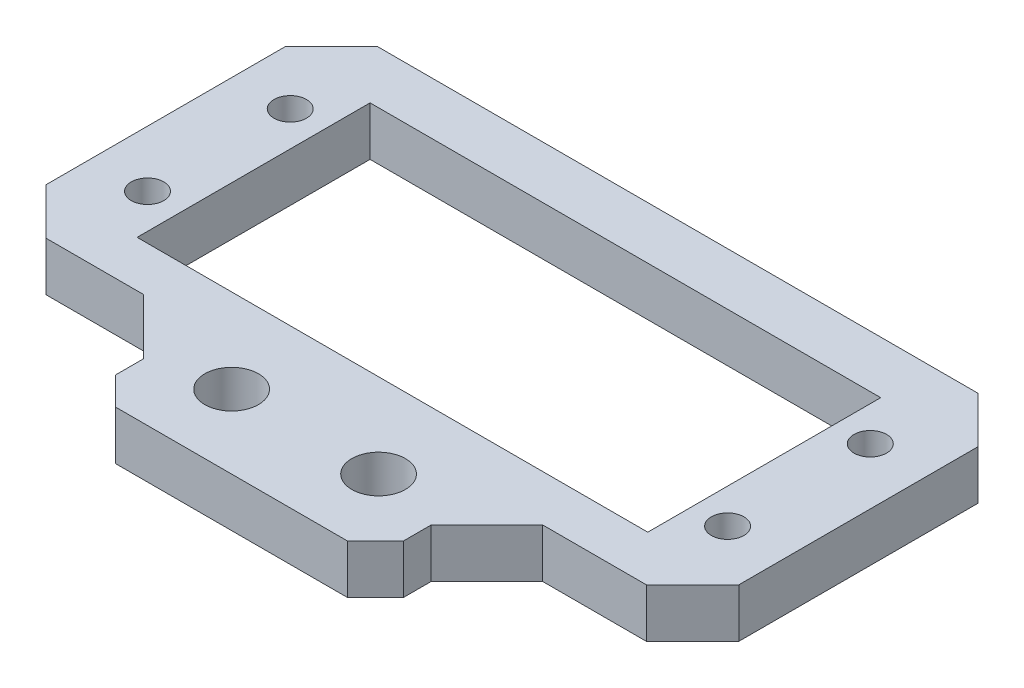
ISO-10303-21;
HEADER;
FILE_DESCRIPTION(('STEP AP214'),'2;1');
FILE_NAME('part.step','',(''),(''),'','','');
FILE_SCHEMA(('AUTOMOTIVE_DESIGN { 1 0 10303 214 1 1 1 1 }'));
ENDSEC;
DATA;
#1=APPLICATION_CONTEXT('core data for automotive mechanical design processes');
#2=APPLICATION_PROTOCOL_DEFINITION('international standard','automotive_design',2000,#1);
#3=PRODUCT_CONTEXT('',#1,'mechanical');
#4=PRODUCT('Part','Part','',(#3));
#5=PRODUCT_RELATED_PRODUCT_CATEGORY('part','',(#4));
#6=PRODUCT_DEFINITION_FORMATION('','',#4);
#7=PRODUCT_DEFINITION_CONTEXT('part definition',#1,'design');
#8=PRODUCT_DEFINITION('design','',#6,#7);
#9=PRODUCT_DEFINITION_SHAPE('','',#8);
#10=(LENGTH_UNIT() NAMED_UNIT(*) SI_UNIT(.MILLI.,.METRE.));
#11=(NAMED_UNIT(*) PLANE_ANGLE_UNIT() SI_UNIT($,.RADIAN.));
#12=(NAMED_UNIT(*) SI_UNIT($,.STERADIAN.) SOLID_ANGLE_UNIT());
#13=UNCERTAINTY_MEASURE_WITH_UNIT(LENGTH_MEASURE(1.E-05),#10,'distance_accuracy_value','');
#14=(GEOMETRIC_REPRESENTATION_CONTEXT(3) GLOBAL_UNCERTAINTY_ASSIGNED_CONTEXT((#13)) GLOBAL_UNIT_ASSIGNED_CONTEXT((#10,
#11,#12)) REPRESENTATION_CONTEXT('',''));
#15=CARTESIAN_POINT('',(0.,0.,0.));
#16=DIRECTION('',(0.,0.,1.));
#17=DIRECTION('',(1.,0.,0.));
#18=AXIS2_PLACEMENT_3D('',#15,#16,#17);
#19=CARTESIAN_POINT('',(0.,6.35,0.));
#20=DIRECTION('',(0.,1.,0.));
#21=DIRECTION('',(0.,0.,1.));
#22=AXIS2_PLACEMENT_3D('',#19,#20,#21);
#23=PLANE('',#22);
#24=CARTESIAN_POINT('',(11.15,6.35,26.022));
#25=DIRECTION('',(0.,1.,0.));
#26=DIRECTION('',(0.,0.,1.));
#27=AXIS2_PLACEMENT_3D('',#24,#25,#26);
#28=CIRCLE('',#27,3.475);
#29=CARTESIAN_POINT('',(11.15,6.35,29.497));
#30=VERTEX_POINT('',#29);
#31=EDGE_CURVE('E649',#30,#30,#28,.T.);
#32=ORIENTED_EDGE('',*,*,#31,.F.);
#33=EDGE_LOOP('',(#32));
#34=FACE_BOUND('',#33,.T.);
#35=CARTESIAN_POINT('',(-16.525,6.35,9.25));
#36=DIRECTION('',(0.,1.,0.));
#37=DIRECTION('',(0.,0.,1.));
#38=AXIS2_PLACEMENT_3D('',#35,#36,#37);
#39=CIRCLE('',#38,2.1082);
#40=CARTESIAN_POINT('',(-16.525,6.35,11.3582));
#41=VERTEX_POINT('',#40);
#42=EDGE_CURVE('E661',#41,#41,#39,.T.);
#43=ORIENTED_EDGE('',*,*,#42,.F.);
#44=EDGE_LOOP('',(#43));
#45=FACE_BOUND('',#44,.T.);
#46=CARTESIAN_POINT('',(58.675,6.35,-9.24999999999999));
#47=DIRECTION('',(0.,1.,0.));
#48=DIRECTION('',(0.,0.,1.));
#49=AXIS2_PLACEMENT_3D('',#46,#47,#48);
#50=CIRCLE('',#49,2.10819999999999);
#51=CARTESIAN_POINT('',(58.675,6.35,-7.1418));
#52=VERTEX_POINT('',#51);
#53=EDGE_CURVE('E198',#52,#52,#50,.T.);
#54=ORIENTED_EDGE('',*,*,#53,.F.);
#55=EDGE_LOOP('',(#54));
#56=FACE_BOUND('',#55,.T.);
#57=DIRECTION('',(-0.707106781186547,0.,0.707106781186548));
#58=VECTOR('',#57,1.);
#59=CARTESIAN_POINT('',(-17.8365349853912,6.35,-21.9));
#60=LINE('',#59,#58);
#61=CARTESIAN_POINT('',(-17.8365349853912,6.35,-21.9));
#62=VERTEX_POINT('',#61);
#63=CARTESIAN_POINT('',(-23.836534985391,6.35,-15.9000000000002));
#64=VERTEX_POINT('',#63);
#65=EDGE_CURVE('E208',#62,#64,#60,.T.);
#66=ORIENTED_EDGE('',*,*,#65,.T.);
#67=DIRECTION('',(0.,0.,1.));
#68=VECTOR('',#67,1.);
#69=CARTESIAN_POINT('',(-23.836534985391,6.35,15.0999999999999));
#70=LINE('',#69,#68);
#71=CARTESIAN_POINT('',(-23.836534985391,6.35,15.0999999999999));
#72=VERTEX_POINT('',#71);
#73=EDGE_CURVE('E211',#64,#72,#70,.T.);
#74=ORIENTED_EDGE('',*,*,#73,.T.);
#75=DIRECTION('',(0.707106781186548,0.,0.707106781186547));
#76=VECTOR('',#75,1.);
#77=CARTESIAN_POINT('',(-23.836534985391,6.35,15.0999999999999));
#78=LINE('',#77,#76);
#79=CARTESIAN_POINT('',(-17.8365349853911,6.35,21.0999999999998));
#80=VERTEX_POINT('',#79);
#81=EDGE_CURVE('E214',#72,#80,#78,.T.);
#82=ORIENTED_EDGE('',*,*,#81,.T.);
#83=DIRECTION('',(1.,0.,0.));
#84=VECTOR('',#83,1.);
#85=CARTESIAN_POINT('',(-5.20135987500388,6.35,21.0999999999998));
#86=LINE('',#85,#84);
#87=CARTESIAN_POINT('',(-5.20135987500388,6.35,21.0999999999998));
#88=VERTEX_POINT('',#87);
#89=EDGE_CURVE('E216',#80,#88,#86,.T.);
#90=ORIENTED_EDGE('',*,*,#89,.T.);
#91=DIRECTION('',(0.707106781186548,0.,0.707106781186547));
#92=VECTOR('',#91,1.);
#93=CARTESIAN_POINT('',(2.02499999999995,6.35,28.3263598750036));
#94=LINE('',#93,#92);
#95=CARTESIAN_POINT('',(2.02499999999995,6.35,28.3263598750036));
#96=VERTEX_POINT('',#95);
#97=EDGE_CURVE('E218',#88,#96,#94,.T.);
#98=ORIENTED_EDGE('',*,*,#97,.T.);
#99=DIRECTION('',(0.,0.,1.));
#100=VECTOR('',#99,1.);
#101=CARTESIAN_POINT('',(2.02499999999995,6.35,31.9395398125056));
#102=LINE('',#101,#100);
#103=CARTESIAN_POINT('',(2.02499999999995,6.35,31.9395398125056));
#104=VERTEX_POINT('',#103);
#105=EDGE_CURVE('E220',#96,#104,#102,.T.);
#106=ORIENTED_EDGE('',*,*,#105,.T.);
#107=DIRECTION('',(0.707106781186548,0.,0.707106781186547));
#108=VECTOR('',#107,1.);
#109=CARTESIAN_POINT('',(2.02499999999995,6.35,31.9395398125056));
#110=LINE('',#109,#108);
#111=CARTESIAN_POINT('',(5.63817993750187,6.35,35.5527197500075));
#112=VERTEX_POINT('',#111);
#113=EDGE_CURVE('E222',#104,#112,#110,.T.);
#114=ORIENTED_EDGE('',*,*,#113,.T.);
#115=DIRECTION('',(1.,0.,0.));
#116=VECTOR('',#115,1.);
#117=CARTESIAN_POINT('',(35.7118200624981,6.35,35.5527197500075));
#118=LINE('',#117,#116);
#119=CARTESIAN_POINT('',(35.7118200624981,6.35,35.5527197500075));
#120=VERTEX_POINT('',#119);
#121=EDGE_CURVE('E224',#112,#120,#118,.T.);
#122=ORIENTED_EDGE('',*,*,#121,.T.);
#123=DIRECTION('',(0.707106781186548,0.,-0.707106781186548));
#124=VECTOR('',#123,1.);
#125=CARTESIAN_POINT('',(39.325,6.35,31.9395398125056));
#126=LINE('',#125,#124);
#127=CARTESIAN_POINT('',(39.325,6.35,31.9395398125056));
#128=VERTEX_POINT('',#127);
#129=EDGE_CURVE('E226',#120,#128,#126,.T.);
#130=ORIENTED_EDGE('',*,*,#129,.T.);
#131=DIRECTION('',(0.,0.,-1.));
#132=VECTOR('',#131,1.);
#133=CARTESIAN_POINT('',(39.325,6.35,31.9395398125056));
#134=LINE('',#133,#132);
#135=CARTESIAN_POINT('',(39.325,6.35,28.3263598750036));
#136=VERTEX_POINT('',#135);
#137=EDGE_CURVE('E228',#128,#136,#134,.T.);
#138=ORIENTED_EDGE('',*,*,#137,.T.);
#139=DIRECTION('',(0.707106781186547,0.,-0.707106781186547));
#140=VECTOR('',#139,1.);
#141=CARTESIAN_POINT('',(39.325,6.35,28.3263598750036));
#142=LINE('',#141,#140);
#143=CARTESIAN_POINT('',(46.5513598750038,6.35,21.0999999999998));
#144=VERTEX_POINT('',#143);
#145=EDGE_CURVE('E230',#136,#144,#142,.T.);
#146=ORIENTED_EDGE('',*,*,#145,.T.);
#147=DIRECTION('',(1.,0.,0.));
#148=VECTOR('',#147,1.);
#149=CARTESIAN_POINT('',(59.986534985391,6.35,21.0999999999998));
#150=LINE('',#149,#148);
#151=CARTESIAN_POINT('',(59.986534985391,6.35,21.0999999999998));
#152=VERTEX_POINT('',#151);
#153=EDGE_CURVE('E232',#144,#152,#150,.T.);
#154=ORIENTED_EDGE('',*,*,#153,.T.);
#155=DIRECTION('',(0.707106781186548,0.,-0.707106781186547));
#156=VECTOR('',#155,1.);
#157=CARTESIAN_POINT('',(65.9865349853909,6.35,15.0999999999999));
#158=LINE('',#157,#156);
#159=CARTESIAN_POINT('',(65.9865349853909,6.35,15.0999999999999));
#160=VERTEX_POINT('',#159);
#161=EDGE_CURVE('E234',#152,#160,#158,.T.);
#162=ORIENTED_EDGE('',*,*,#161,.T.);
#163=DIRECTION('',(0.,0.,-1.));
#164=VECTOR('',#163,1.);
#165=CARTESIAN_POINT('',(65.9865349853909,6.35,15.0999999999999));
#166=LINE('',#165,#164);
#167=CARTESIAN_POINT('',(65.9865349853909,6.35,-15.9000000000002));
#168=VERTEX_POINT('',#167);
#169=EDGE_CURVE('E236',#160,#168,#166,.T.);
#170=ORIENTED_EDGE('',*,*,#169,.T.);
#171=DIRECTION('',(-0.707106781186546,0.,-0.707106781186549));
#172=VECTOR('',#171,1.);
#173=CARTESIAN_POINT('',(59.9865349853912,6.35,-21.9));
#174=LINE('',#173,#172);
#175=CARTESIAN_POINT('',(59.9865349853912,6.35,-21.9));
#176=VERTEX_POINT('',#175);
#177=EDGE_CURVE('E238',#168,#176,#174,.T.);
#178=ORIENTED_EDGE('',*,*,#177,.T.);
#179=DIRECTION('',(-1.,0.,0.));
#180=VECTOR('',#179,1.);
#181=CARTESIAN_POINT('',(59.9865349853912,6.35,-21.9));
#182=LINE('',#181,#180);
#183=EDGE_CURVE('E240',#176,#62,#182,.T.);
#184=ORIENTED_EDGE('',*,*,#183,.T.);
#185=EDGE_LOOP('',(#66,#74,#82,#90,#98,#106,#114,#122,#130,#138,#146,#154,#162,#170,#178,#184));
#186=FACE_BOUND('',#185,.T.);
#187=DIRECTION('',(1.,0.,0.));
#188=VECTOR('',#187,1.);
#189=CARTESIAN_POINT('',(54.175,6.35,15.1));
#190=LINE('',#189,#188);
#191=CARTESIAN_POINT('',(-12.025,6.35,15.1));
#192=VERTEX_POINT('',#191);
#193=CARTESIAN_POINT('',(54.175,6.35,15.1));
#194=VERTEX_POINT('',#193);
#195=EDGE_CURVE('E177',#192,#194,#190,.T.);
#196=ORIENTED_EDGE('',*,*,#195,.F.);
#197=DIRECTION('',(0.,0.,1.));
#198=VECTOR('',#197,1.);
#199=CARTESIAN_POINT('',(-12.025,6.35,15.1));
#200=LINE('',#199,#198);
#201=CARTESIAN_POINT('',(-12.025,6.35,-15.1));
#202=VERTEX_POINT('',#201);
#203=EDGE_CURVE('E169',#202,#192,#200,.T.);
#204=ORIENTED_EDGE('',*,*,#203,.F.);
#205=DIRECTION('',(-1.,0.,0.));
#206=VECTOR('',#205,1.);
#207=CARTESIAN_POINT('',(54.175,6.35,-15.1));
#208=LINE('',#207,#206);
#209=CARTESIAN_POINT('',(54.175,6.35,-15.1));
#210=VERTEX_POINT('',#209);
#211=EDGE_CURVE('E192',#210,#202,#208,.T.);
#212=ORIENTED_EDGE('',*,*,#211,.F.);
#213=DIRECTION('',(0.,0.,-1.));
#214=VECTOR('',#213,1.);
#215=CARTESIAN_POINT('',(54.175,6.35,15.1));
#216=LINE('',#215,#214);
#217=EDGE_CURVE('E190',#194,#210,#216,.T.);
#218=ORIENTED_EDGE('',*,*,#217,.F.);
#219=EDGE_LOOP('',(#196,#204,#212,#218));
#220=FACE_BOUND('',#219,.T.);
#221=CARTESIAN_POINT('',(58.675,6.35,9.24999999999999));
#222=DIRECTION('',(0.,1.,0.));
#223=DIRECTION('',(0.,0.,-1.));
#224=AXIS2_PLACEMENT_3D('',#221,#222,#223);
#225=CIRCLE('',#224,2.10819999999999);
#226=CARTESIAN_POINT('',(58.675,6.35,7.1418));
#227=VERTEX_POINT('',#226);
#228=EDGE_CURVE('E667',#227,#227,#225,.T.);
#229=ORIENTED_EDGE('',*,*,#228,.F.);
#230=EDGE_LOOP('',(#229));
#231=FACE_BOUND('',#230,.T.);
#232=CARTESIAN_POINT('',(-16.525,6.35,-9.25));
#233=DIRECTION('',(0.,1.,0.));
#234=DIRECTION('',(0.,0.,-1.));
#235=AXIS2_PLACEMENT_3D('',#232,#233,#234);
#236=CIRCLE('',#235,2.1082);
#237=CARTESIAN_POINT('',(-16.525,6.35,-11.3582));
#238=VERTEX_POINT('',#237);
#239=EDGE_CURVE('E655',#238,#238,#236,.T.);
#240=ORIENTED_EDGE('',*,*,#239,.F.);
#241=EDGE_LOOP('',(#240));
#242=FACE_BOUND('',#241,.T.);
#243=CARTESIAN_POINT('',(30.2,6.35,26.022));
#244=DIRECTION('',(0.,1.,0.));
#245=DIRECTION('',(0.,0.,-1.));
#246=AXIS2_PLACEMENT_3D('',#243,#244,#245);
#247=CIRCLE('',#246,3.475);
#248=CARTESIAN_POINT('',(30.2,6.35,22.547));
#249=VERTEX_POINT('',#248);
#250=EDGE_CURVE('E640',#249,#249,#247,.T.);
#251=ORIENTED_EDGE('',*,*,#250,.F.);
#252=EDGE_LOOP('',(#251));
#253=FACE_BOUND('',#252,.T.);
#254=ADVANCED_FACE('F32',(#34,#45,#56,#186,#220,#231,#242,#253),#23,.T.);
#255=CARTESIAN_POINT('',(0.,0.,0.));
#256=DIRECTION('',(0.,1.,0.));
#257=DIRECTION('',(0.,0.,1.));
#258=AXIS2_PLACEMENT_3D('',#255,#256,#257);
#259=PLANE('',#258);
#260=CARTESIAN_POINT('',(11.15,0.,26.022));
#261=DIRECTION('',(0.,1.,0.));
#262=DIRECTION('',(0.,0.,1.));
#263=AXIS2_PLACEMENT_3D('',#260,#261,#262);
#264=CIRCLE('',#263,3.475);
#265=CARTESIAN_POINT('',(11.15,0.,29.497));
#266=VERTEX_POINT('',#265);
#267=EDGE_CURVE('E646',#266,#266,#264,.T.);
#268=ORIENTED_EDGE('',*,*,#267,.T.);
#269=EDGE_LOOP('',(#268));
#270=FACE_BOUND('',#269,.T.);
#271=CARTESIAN_POINT('',(-16.525,0.,9.25));
#272=DIRECTION('',(0.,1.,0.));
#273=DIRECTION('',(0.,0.,1.));
#274=AXIS2_PLACEMENT_3D('',#271,#272,#273);
#275=CIRCLE('',#274,2.1082);
#276=CARTESIAN_POINT('',(-16.525,0.,11.3582));
#277=VERTEX_POINT('',#276);
#278=EDGE_CURVE('E658',#277,#277,#275,.T.);
#279=ORIENTED_EDGE('',*,*,#278,.T.);
#280=EDGE_LOOP('',(#279));
#281=FACE_BOUND('',#280,.T.);
#282=CARTESIAN_POINT('',(58.675,0.,-9.24999999999999));
#283=DIRECTION('',(0.,1.,0.));
#284=DIRECTION('',(0.,0.,1.));
#285=AXIS2_PLACEMENT_3D('',#282,#283,#284);
#286=CIRCLE('',#285,2.10819999999999);
#287=CARTESIAN_POINT('',(58.675,0.,-7.1418));
#288=VERTEX_POINT('',#287);
#289=EDGE_CURVE('E670',#288,#288,#286,.T.);
#290=ORIENTED_EDGE('',*,*,#289,.T.);
#291=EDGE_LOOP('',(#290));
#292=FACE_BOUND('',#291,.T.);
#293=DIRECTION('',(-0.707106781186547,0.,0.707106781186548));
#294=VECTOR('',#293,1.);
#295=CARTESIAN_POINT('',(-17.8365349853912,0.,-21.9));
#296=LINE('',#295,#294);
#297=CARTESIAN_POINT('',(-17.8365349853912,0.,-21.9));
#298=VERTEX_POINT('',#297);
#299=CARTESIAN_POINT('',(-23.836534985391,0.,-15.9000000000002));
#300=VERTEX_POINT('',#299);
#301=EDGE_CURVE('E185',#298,#300,#296,.T.);
#302=ORIENTED_EDGE('',*,*,#301,.F.);
#303=DIRECTION('',(-1.,0.,0.));
#304=VECTOR('',#303,1.);
#305=CARTESIAN_POINT('',(59.9865349853912,0.,-21.9));
#306=LINE('',#305,#304);
#307=CARTESIAN_POINT('',(59.9865349853912,0.,-21.9));
#308=VERTEX_POINT('',#307);
#309=EDGE_CURVE('E212',#308,#298,#306,.T.);
#310=ORIENTED_EDGE('',*,*,#309,.F.);
#311=DIRECTION('',(-0.707106781186546,0.,-0.707106781186549));
#312=VECTOR('',#311,1.);
#313=CARTESIAN_POINT('',(59.9865349853912,0.,-21.9));
#314=LINE('',#313,#312);
#315=CARTESIAN_POINT('',(65.9865349853909,0.,-15.9000000000002));
#316=VERTEX_POINT('',#315);
#317=EDGE_CURVE('E271',#316,#308,#314,.T.);
#318=ORIENTED_EDGE('',*,*,#317,.F.);
#319=DIRECTION('',(0.,0.,-1.));
#320=VECTOR('',#319,1.);
#321=CARTESIAN_POINT('',(65.9865349853909,0.,15.0999999999999));
#322=LINE('',#321,#320);
#323=CARTESIAN_POINT('',(65.9865349853909,0.,15.0999999999999));
#324=VERTEX_POINT('',#323);
#325=EDGE_CURVE('E269',#324,#316,#322,.T.);
#326=ORIENTED_EDGE('',*,*,#325,.F.);
#327=DIRECTION('',(0.707106781186548,0.,-0.707106781186547));
#328=VECTOR('',#327,1.);
#329=CARTESIAN_POINT('',(65.9865349853909,0.,15.0999999999999));
#330=LINE('',#329,#328);
#331=CARTESIAN_POINT('',(59.986534985391,0.,21.0999999999998));
#332=VERTEX_POINT('',#331);
#333=EDGE_CURVE('E267',#332,#324,#330,.T.);
#334=ORIENTED_EDGE('',*,*,#333,.F.);
#335=DIRECTION('',(1.,0.,0.));
#336=VECTOR('',#335,1.);
#337=CARTESIAN_POINT('',(59.986534985391,0.,21.0999999999998));
#338=LINE('',#337,#336);
#339=CARTESIAN_POINT('',(46.5513598750038,0.,21.0999999999998));
#340=VERTEX_POINT('',#339);
#341=EDGE_CURVE('E265',#340,#332,#338,.T.);
#342=ORIENTED_EDGE('',*,*,#341,.F.);
#343=DIRECTION('',(0.707106781186547,0.,-0.707106781186547));
#344=VECTOR('',#343,1.);
#345=CARTESIAN_POINT('',(39.325,0.,28.3263598750036));
#346=LINE('',#345,#344);
#347=CARTESIAN_POINT('',(39.325,0.,28.3263598750036));
#348=VERTEX_POINT('',#347);
#349=EDGE_CURVE('E263',#348,#340,#346,.T.);
#350=ORIENTED_EDGE('',*,*,#349,.F.);
#351=DIRECTION('',(0.,0.,-1.));
#352=VECTOR('',#351,1.);
#353=CARTESIAN_POINT('',(39.325,0.,31.9395398125056));
#354=LINE('',#353,#352);
#355=CARTESIAN_POINT('',(39.325,0.,31.9395398125056));
#356=VERTEX_POINT('',#355);
#357=EDGE_CURVE('E261',#356,#348,#354,.T.);
#358=ORIENTED_EDGE('',*,*,#357,.F.);
#359=DIRECTION('',(0.707106781186548,0.,-0.707106781186548));
#360=VECTOR('',#359,1.);
#361=CARTESIAN_POINT('',(39.325,0.,31.9395398125056));
#362=LINE('',#361,#360);
#363=CARTESIAN_POINT('',(35.7118200624981,0.,35.5527197500075));
#364=VERTEX_POINT('',#363);
#365=EDGE_CURVE('E259',#364,#356,#362,.T.);
#366=ORIENTED_EDGE('',*,*,#365,.F.);
#367=DIRECTION('',(1.,0.,0.));
#368=VECTOR('',#367,1.);
#369=CARTESIAN_POINT('',(35.7118200624981,0.,35.5527197500075));
#370=LINE('',#369,#368);
#371=CARTESIAN_POINT('',(5.63817993750187,0.,35.5527197500075));
#372=VERTEX_POINT('',#371);
#373=EDGE_CURVE('E257',#372,#364,#370,.T.);
#374=ORIENTED_EDGE('',*,*,#373,.F.);
#375=DIRECTION('',(0.707106781186548,0.,0.707106781186547));
#376=VECTOR('',#375,1.);
#377=CARTESIAN_POINT('',(2.02499999999995,0.,31.9395398125056));
#378=LINE('',#377,#376);
#379=CARTESIAN_POINT('',(2.02499999999995,0.,31.9395398125056));
#380=VERTEX_POINT('',#379);
#381=EDGE_CURVE('E255',#380,#372,#378,.T.);
#382=ORIENTED_EDGE('',*,*,#381,.F.);
#383=DIRECTION('',(0.,0.,1.));
#384=VECTOR('',#383,1.);
#385=CARTESIAN_POINT('',(2.02499999999995,0.,31.9395398125056));
#386=LINE('',#385,#384);
#387=CARTESIAN_POINT('',(2.02499999999995,0.,28.3263598750036));
#388=VERTEX_POINT('',#387);
#389=EDGE_CURVE('E253',#388,#380,#386,.T.);
#390=ORIENTED_EDGE('',*,*,#389,.F.);
#391=DIRECTION('',(0.707106781186548,0.,0.707106781186547));
#392=VECTOR('',#391,1.);
#393=CARTESIAN_POINT('',(2.02499999999995,0.,28.3263598750036));
#394=LINE('',#393,#392);
#395=CARTESIAN_POINT('',(-5.20135987500388,0.,21.0999999999998));
#396=VERTEX_POINT('',#395);
#397=EDGE_CURVE('E251',#396,#388,#394,.T.);
#398=ORIENTED_EDGE('',*,*,#397,.F.);
#399=DIRECTION('',(1.,0.,0.));
#400=VECTOR('',#399,1.);
#401=CARTESIAN_POINT('',(-5.20135987500388,0.,21.0999999999998));
#402=LINE('',#401,#400);
#403=CARTESIAN_POINT('',(-17.8365349853911,0.,21.0999999999998));
#404=VERTEX_POINT('',#403);
#405=EDGE_CURVE('E249',#404,#396,#402,.T.);
#406=ORIENTED_EDGE('',*,*,#405,.F.);
#407=DIRECTION('',(0.707106781186548,0.,0.707106781186547));
#408=VECTOR('',#407,1.);
#409=CARTESIAN_POINT('',(-23.836534985391,0.,15.0999999999999));
#410=LINE('',#409,#408);
#411=CARTESIAN_POINT('',(-23.836534985391,0.,15.0999999999999));
#412=VERTEX_POINT('',#411);
#413=EDGE_CURVE('E247',#412,#404,#410,.T.);
#414=ORIENTED_EDGE('',*,*,#413,.F.);
#415=DIRECTION('',(0.,0.,1.));
#416=VECTOR('',#415,1.);
#417=CARTESIAN_POINT('',(-23.836534985391,0.,15.0999999999999));
#418=LINE('',#417,#416);
#419=EDGE_CURVE('E245',#300,#412,#418,.T.);
#420=ORIENTED_EDGE('',*,*,#419,.F.);
#421=EDGE_LOOP('',(#302,#310,#318,#326,#334,#342,#350,#358,#366,#374,#382,#390,#398,#406,#414,#420));
#422=FACE_BOUND('',#421,.T.);
#423=DIRECTION('',(0.,0.,1.));
#424=VECTOR('',#423,1.);
#425=CARTESIAN_POINT('',(-12.025,0.,15.1));
#426=LINE('',#425,#424);
#427=CARTESIAN_POINT('',(-12.025,0.,-15.1));
#428=VERTEX_POINT('',#427);
#429=CARTESIAN_POINT('',(-12.025,0.,15.1));
#430=VERTEX_POINT('',#429);
#431=EDGE_CURVE('E55',#428,#430,#426,.T.);
#432=ORIENTED_EDGE('',*,*,#431,.T.);
#433=DIRECTION('',(1.,0.,0.));
#434=VECTOR('',#433,1.);
#435=CARTESIAN_POINT('',(54.175,0.,15.1));
#436=LINE('',#435,#434);
#437=CARTESIAN_POINT('',(54.175,0.,15.1));
#438=VERTEX_POINT('',#437);
#439=EDGE_CURVE('E184',#430,#438,#436,.T.);
#440=ORIENTED_EDGE('',*,*,#439,.T.);
#441=DIRECTION('',(0.,0.,-1.));
#442=VECTOR('',#441,1.);
#443=CARTESIAN_POINT('',(54.175,0.,15.1));
#444=LINE('',#443,#442);
#445=CARTESIAN_POINT('',(54.175,0.,-15.1));
#446=VERTEX_POINT('',#445);
#447=EDGE_CURVE('E200',#438,#446,#444,.T.);
#448=ORIENTED_EDGE('',*,*,#447,.T.);
#449=DIRECTION('',(-1.,0.,0.));
#450=VECTOR('',#449,1.);
#451=CARTESIAN_POINT('',(54.175,0.,-15.1));
#452=LINE('',#451,#450);
#453=EDGE_CURVE('E178',#446,#428,#452,.T.);
#454=ORIENTED_EDGE('',*,*,#453,.T.);
#455=EDGE_LOOP('',(#432,#440,#448,#454));
#456=FACE_BOUND('',#455,.T.);
#457=CARTESIAN_POINT('',(58.675,0.,9.24999999999999));
#458=DIRECTION('',(0.,1.,0.));
#459=DIRECTION('',(0.,0.,-1.));
#460=AXIS2_PLACEMENT_3D('',#457,#458,#459);
#461=CIRCLE('',#460,2.10819999999999);
#462=CARTESIAN_POINT('',(58.675,0.,7.1418));
#463=VERTEX_POINT('',#462);
#464=EDGE_CURVE('E664',#463,#463,#461,.T.);
#465=ORIENTED_EDGE('',*,*,#464,.T.);
#466=EDGE_LOOP('',(#465));
#467=FACE_BOUND('',#466,.T.);
#468=CARTESIAN_POINT('',(-16.525,0.,-9.25));
#469=DIRECTION('',(0.,1.,0.));
#470=DIRECTION('',(0.,0.,-1.));
#471=AXIS2_PLACEMENT_3D('',#468,#469,#470);
#472=CIRCLE('',#471,2.1082);
#473=CARTESIAN_POINT('',(-16.525,0.,-11.3582));
#474=VERTEX_POINT('',#473);
#475=EDGE_CURVE('E652',#474,#474,#472,.T.);
#476=ORIENTED_EDGE('',*,*,#475,.T.);
#477=EDGE_LOOP('',(#476));
#478=FACE_BOUND('',#477,.T.);
#479=CARTESIAN_POINT('',(30.2,0.,26.022));
#480=DIRECTION('',(0.,1.,0.));
#481=DIRECTION('',(0.,0.,-1.));
#482=AXIS2_PLACEMENT_3D('',#479,#480,#481);
#483=CIRCLE('',#482,3.475);
#484=CARTESIAN_POINT('',(30.2,0.,22.547));
#485=VERTEX_POINT('',#484);
#486=EDGE_CURVE('E643',#485,#485,#483,.T.);
#487=ORIENTED_EDGE('',*,*,#486,.T.);
#488=EDGE_LOOP('',(#487));
#489=FACE_BOUND('',#488,.T.);
#490=ADVANCED_FACE('F325',(#270,#281,#292,#422,#456,#467,#478,#489),#259,.F.);
#491=CARTESIAN_POINT('',(-17.8365349853912,6.35,-21.9));
#492=DIRECTION('',(0.707106781186548,0.,0.707106781186547));
#493=DIRECTION('',(0.707106781186547,0.,-0.707106781186548));
#494=AXIS2_PLACEMENT_3D('',#491,#492,#493);
#495=PLANE('',#494);
#496=ORIENTED_EDGE('',*,*,#301,.T.);
#497=DIRECTION('',(0.,-1.,0.));
#498=VECTOR('',#497,1.);
#499=CARTESIAN_POINT('',(-23.836534985391,6.35,-15.9000000000002));
#500=LINE('',#499,#498);
#501=EDGE_CURVE('E11',#64,#300,#500,.T.);
#502=ORIENTED_EDGE('',*,*,#501,.F.);
#503=ORIENTED_EDGE('',*,*,#65,.F.);
#504=DIRECTION('',(0.,-1.,0.));
#505=VECTOR('',#504,1.);
#506=CARTESIAN_POINT('',(-17.8365349853912,6.35,-21.9));
#507=LINE('',#506,#505);
#508=EDGE_CURVE('E242',#62,#298,#507,.T.);
#509=ORIENTED_EDGE('',*,*,#508,.T.);
#510=EDGE_LOOP('',(#496,#502,#503,#509));
#511=FACE_BOUND('',#510,.T.);
#512=ADVANCED_FACE('F34',(#511),#495,.F.);
#513=CARTESIAN_POINT('',(-23.836534985391,6.35,15.0999999999999));
#514=DIRECTION('',(1.,0.,0.));
#515=DIRECTION('',(0.,0.,-1.));
#516=AXIS2_PLACEMENT_3D('',#513,#514,#515);
#517=PLANE('',#516);
#518=ORIENTED_EDGE('',*,*,#419,.T.);
#519=DIRECTION('',(0.,-1.,0.));
#520=VECTOR('',#519,1.);
#521=CARTESIAN_POINT('',(-23.836534985391,6.35,15.0999999999999));
#522=LINE('',#521,#520);
#523=EDGE_CURVE('E40',#72,#412,#522,.T.);
#524=ORIENTED_EDGE('',*,*,#523,.F.);
#525=ORIENTED_EDGE('',*,*,#73,.F.);
#526=ORIENTED_EDGE('',*,*,#501,.T.);
#527=EDGE_LOOP('',(#518,#524,#525,#526));
#528=FACE_BOUND('',#527,.T.);
#529=ADVANCED_FACE('F342',(#528),#517,.F.);
#530=CARTESIAN_POINT('',(-23.836534985391,6.35,15.0999999999999));
#531=DIRECTION('',(0.707106781186547,0.,-0.707106781186548));
#532=DIRECTION('',(-0.707106781186548,0.,-0.707106781186547));
#533=AXIS2_PLACEMENT_3D('',#530,#531,#532);
#534=PLANE('',#533);
#535=ORIENTED_EDGE('',*,*,#413,.T.);
#536=DIRECTION('',(0.,-1.,0.));
#537=VECTOR('',#536,1.);
#538=CARTESIAN_POINT('',(-17.8365349853911,6.35,21.0999999999998));
#539=LINE('',#538,#537);
#540=EDGE_CURVE('E312',#80,#404,#539,.T.);
#541=ORIENTED_EDGE('',*,*,#540,.F.);
#542=ORIENTED_EDGE('',*,*,#81,.F.);
#543=ORIENTED_EDGE('',*,*,#523,.T.);
#544=EDGE_LOOP('',(#535,#541,#542,#543));
#545=FACE_BOUND('',#544,.T.);
#546=ADVANCED_FACE('F319',(#545),#534,.F.);
#547=CARTESIAN_POINT('',(-5.20135987500388,6.35,21.0999999999998));
#548=DIRECTION('',(0.,0.,-1.));
#549=DIRECTION('',(-1.,0.,0.));
#550=AXIS2_PLACEMENT_3D('',#547,#548,#549);
#551=PLANE('',#550);
#552=ORIENTED_EDGE('',*,*,#405,.T.);
#553=DIRECTION('',(0.,-1.,0.));
#554=VECTOR('',#553,1.);
#555=CARTESIAN_POINT('',(-5.20135987500388,6.35,21.0999999999998));
#556=LINE('',#555,#554);
#557=EDGE_CURVE('E309',#88,#396,#556,.T.);
#558=ORIENTED_EDGE('',*,*,#557,.F.);
#559=ORIENTED_EDGE('',*,*,#89,.F.);
#560=ORIENTED_EDGE('',*,*,#540,.T.);
#561=EDGE_LOOP('',(#552,#558,#559,#560));
#562=FACE_BOUND('',#561,.T.);
#563=ADVANCED_FACE('F331',(#562),#551,.F.);
#564=CARTESIAN_POINT('',(2.02499999999995,6.35,28.3263598750036));
#565=DIRECTION('',(0.707106781186547,0.,-0.707106781186548));
#566=DIRECTION('',(-0.707106781186548,0.,-0.707106781186547));
#567=AXIS2_PLACEMENT_3D('',#564,#565,#566);
#568=PLANE('',#567);
#569=ORIENTED_EDGE('',*,*,#397,.T.);
#570=DIRECTION('',(0.,-1.,0.));
#571=VECTOR('',#570,1.);
#572=CARTESIAN_POINT('',(2.02499999999995,6.35,28.3263598750036));
#573=LINE('',#572,#571);
#574=EDGE_CURVE('E306',#96,#388,#573,.T.);
#575=ORIENTED_EDGE('',*,*,#574,.F.);
#576=ORIENTED_EDGE('',*,*,#97,.F.);
#577=ORIENTED_EDGE('',*,*,#557,.T.);
#578=EDGE_LOOP('',(#569,#575,#576,#577));
#579=FACE_BOUND('',#578,.T.);
#580=ADVANCED_FACE('F335',(#579),#568,.F.);
#581=CARTESIAN_POINT('',(2.02499999999995,6.35,31.9395398125056));
#582=DIRECTION('',(1.,0.,0.));
#583=DIRECTION('',(0.,0.,-1.));
#584=AXIS2_PLACEMENT_3D('',#581,#582,#583);
#585=PLANE('',#584);
#586=ORIENTED_EDGE('',*,*,#389,.T.);
#587=DIRECTION('',(0.,-1.,0.));
#588=VECTOR('',#587,1.);
#589=CARTESIAN_POINT('',(2.02499999999995,6.35,31.9395398125056));
#590=LINE('',#589,#588);
#591=EDGE_CURVE('E303',#104,#380,#590,.T.);
#592=ORIENTED_EDGE('',*,*,#591,.F.);
#593=ORIENTED_EDGE('',*,*,#105,.F.);
#594=ORIENTED_EDGE('',*,*,#574,.T.);
#595=EDGE_LOOP('',(#586,#592,#593,#594));
#596=FACE_BOUND('',#595,.T.);
#597=ADVANCED_FACE('F395',(#596),#585,.F.);
#598=CARTESIAN_POINT('',(2.02499999999995,6.35,31.9395398125056));
#599=DIRECTION('',(0.707106781186547,0.,-0.707106781186548));
#600=DIRECTION('',(-0.707106781186548,0.,-0.707106781186547));
#601=AXIS2_PLACEMENT_3D('',#598,#599,#600);
#602=PLANE('',#601);
#603=ORIENTED_EDGE('',*,*,#381,.T.);
#604=DIRECTION('',(0.,-1.,0.));
#605=VECTOR('',#604,1.);
#606=CARTESIAN_POINT('',(5.63817993750187,6.35,35.5527197500075));
#607=LINE('',#606,#605);
#608=EDGE_CURVE('E300',#112,#372,#607,.T.);
#609=ORIENTED_EDGE('',*,*,#608,.F.);
#610=ORIENTED_EDGE('',*,*,#113,.F.);
#611=ORIENTED_EDGE('',*,*,#591,.T.);
#612=EDGE_LOOP('',(#603,#609,#610,#611));
#613=FACE_BOUND('',#612,.T.);
#614=ADVANCED_FACE('F392',(#613),#602,.F.);
#615=CARTESIAN_POINT('',(35.7118200624981,6.35,35.5527197500075));
#616=DIRECTION('',(0.,0.,-1.));
#617=DIRECTION('',(-1.,0.,0.));
#618=AXIS2_PLACEMENT_3D('',#615,#616,#617);
#619=PLANE('',#618);
#620=ORIENTED_EDGE('',*,*,#373,.T.);
#621=DIRECTION('',(0.,-1.,0.));
#622=VECTOR('',#621,1.);
#623=CARTESIAN_POINT('',(35.7118200624981,6.35,35.5527197500075));
#624=LINE('',#623,#622);
#625=EDGE_CURVE('E297',#120,#364,#624,.T.);
#626=ORIENTED_EDGE('',*,*,#625,.F.);
#627=ORIENTED_EDGE('',*,*,#121,.F.);
#628=ORIENTED_EDGE('',*,*,#608,.T.);
#629=EDGE_LOOP('',(#620,#626,#627,#628));
#630=FACE_BOUND('',#629,.T.);
#631=ADVANCED_FACE('F388',(#630),#619,.F.);
#632=CARTESIAN_POINT('',(39.325,6.35,31.9395398125056));
#633=DIRECTION('',(-0.707106781186548,0.,-0.707106781186548));
#634=DIRECTION('',(-0.707106781186548,0.,0.707106781186548));
#635=AXIS2_PLACEMENT_3D('',#632,#633,#634);
#636=PLANE('',#635);
#637=ORIENTED_EDGE('',*,*,#365,.T.);
#638=DIRECTION('',(0.,-1.,0.));
#639=VECTOR('',#638,1.);
#640=CARTESIAN_POINT('',(39.325,6.35,31.9395398125056));
#641=LINE('',#640,#639);
#642=EDGE_CURVE('E294',#128,#356,#641,.T.);
#643=ORIENTED_EDGE('',*,*,#642,.F.);
#644=ORIENTED_EDGE('',*,*,#129,.F.);
#645=ORIENTED_EDGE('',*,*,#625,.T.);
#646=EDGE_LOOP('',(#637,#643,#644,#645));
#647=FACE_BOUND('',#646,.T.);
#648=ADVANCED_FACE('F384',(#647),#636,.F.);
#649=CARTESIAN_POINT('',(39.325,6.35,31.9395398125056));
#650=DIRECTION('',(-1.,0.,0.));
#651=DIRECTION('',(0.,0.,1.));
#652=AXIS2_PLACEMENT_3D('',#649,#650,#651);
#653=PLANE('',#652);
#654=ORIENTED_EDGE('',*,*,#357,.T.);
#655=DIRECTION('',(0.,-1.,0.));
#656=VECTOR('',#655,1.);
#657=CARTESIAN_POINT('',(39.325,6.35,28.3263598750036));
#658=LINE('',#657,#656);
#659=EDGE_CURVE('E291',#136,#348,#658,.T.);
#660=ORIENTED_EDGE('',*,*,#659,.F.);
#661=ORIENTED_EDGE('',*,*,#137,.F.);
#662=ORIENTED_EDGE('',*,*,#642,.T.);
#663=EDGE_LOOP('',(#654,#660,#661,#662));
#664=FACE_BOUND('',#663,.T.);
#665=ADVANCED_FACE('F379',(#664),#653,.F.);
#666=CARTESIAN_POINT('',(39.325,6.35,28.3263598750036));
#667=DIRECTION('',(-0.707106781186548,0.,-0.707106781186548));
#668=DIRECTION('',(-0.707106781186548,0.,0.707106781186548));
#669=AXIS2_PLACEMENT_3D('',#666,#667,#668);
#670=PLANE('',#669);
#671=ORIENTED_EDGE('',*,*,#349,.T.);
#672=DIRECTION('',(0.,-1.,0.));
#673=VECTOR('',#672,1.);
#674=CARTESIAN_POINT('',(46.5513598750038,6.35,21.0999999999998));
#675=LINE('',#674,#673);
#676=EDGE_CURVE('E288',#144,#340,#675,.T.);
#677=ORIENTED_EDGE('',*,*,#676,.F.);
#678=ORIENTED_EDGE('',*,*,#145,.F.);
#679=ORIENTED_EDGE('',*,*,#659,.T.);
#680=EDGE_LOOP('',(#671,#677,#678,#679));
#681=FACE_BOUND('',#680,.T.);
#682=ADVANCED_FACE('F373',(#681),#670,.F.);
#683=CARTESIAN_POINT('',(59.986534985391,6.35,21.0999999999998));
#684=DIRECTION('',(0.,0.,-1.));
#685=DIRECTION('',(-1.,0.,0.));
#686=AXIS2_PLACEMENT_3D('',#683,#684,#685);
#687=PLANE('',#686);
#688=ORIENTED_EDGE('',*,*,#341,.T.);
#689=DIRECTION('',(0.,-1.,0.));
#690=VECTOR('',#689,1.);
#691=CARTESIAN_POINT('',(59.986534985391,6.35,21.0999999999998));
#692=LINE('',#691,#690);
#693=EDGE_CURVE('E285',#152,#332,#692,.T.);
#694=ORIENTED_EDGE('',*,*,#693,.F.);
#695=ORIENTED_EDGE('',*,*,#153,.F.);
#696=ORIENTED_EDGE('',*,*,#676,.T.);
#697=EDGE_LOOP('',(#688,#694,#695,#696));
#698=FACE_BOUND('',#697,.T.);
#699=ADVANCED_FACE('F369',(#698),#687,.F.);
#700=CARTESIAN_POINT('',(65.9865349853909,6.35,15.0999999999999));
#701=DIRECTION('',(-0.707106781186547,0.,-0.707106781186548));
#702=DIRECTION('',(-0.707106781186548,0.,0.707106781186547));
#703=AXIS2_PLACEMENT_3D('',#700,#701,#702);
#704=PLANE('',#703);
#705=ORIENTED_EDGE('',*,*,#333,.T.);
#706=DIRECTION('',(0.,-1.,0.));
#707=VECTOR('',#706,1.);
#708=CARTESIAN_POINT('',(65.9865349853909,6.35,15.0999999999999));
#709=LINE('',#708,#707);
#710=EDGE_CURVE('E282',#160,#324,#709,.T.);
#711=ORIENTED_EDGE('',*,*,#710,.F.);
#712=ORIENTED_EDGE('',*,*,#161,.F.);
#713=ORIENTED_EDGE('',*,*,#693,.T.);
#714=EDGE_LOOP('',(#705,#711,#712,#713));
#715=FACE_BOUND('',#714,.T.);
#716=ADVANCED_FACE('F364',(#715),#704,.F.);
#717=CARTESIAN_POINT('',(65.9865349853909,6.35,15.0999999999999));
#718=DIRECTION('',(-1.,0.,0.));
#719=DIRECTION('',(0.,0.,1.));
#720=AXIS2_PLACEMENT_3D('',#717,#718,#719);
#721=PLANE('',#720);
#722=ORIENTED_EDGE('',*,*,#325,.T.);
#723=DIRECTION('',(0.,-1.,0.));
#724=VECTOR('',#723,1.);
#725=CARTESIAN_POINT('',(65.9865349853909,6.35,-15.9000000000002));
#726=LINE('',#725,#724);
#727=EDGE_CURVE('E279',#168,#316,#726,.T.);
#728=ORIENTED_EDGE('',*,*,#727,.F.);
#729=ORIENTED_EDGE('',*,*,#169,.F.);
#730=ORIENTED_EDGE('',*,*,#710,.T.);
#731=EDGE_LOOP('',(#722,#728,#729,#730));
#732=FACE_BOUND('',#731,.T.);
#733=ADVANCED_FACE('F358',(#732),#721,.F.);
#734=CARTESIAN_POINT('',(59.9865349853912,6.35,-21.9));
#735=DIRECTION('',(-0.707106781186548,0.,0.707106781186546));
#736=DIRECTION('',(0.707106781186547,0.,0.707106781186549));
#737=AXIS2_PLACEMENT_3D('',#734,#735,#736);
#738=PLANE('',#737);
#739=ORIENTED_EDGE('',*,*,#317,.T.);
#740=DIRECTION('',(0.,-1.,0.));
#741=VECTOR('',#740,1.);
#742=CARTESIAN_POINT('',(59.9865349853912,6.35,-21.9));
#743=LINE('',#742,#741);
#744=EDGE_CURVE('E276',#176,#308,#743,.T.);
#745=ORIENTED_EDGE('',*,*,#744,.F.);
#746=ORIENTED_EDGE('',*,*,#177,.F.);
#747=ORIENTED_EDGE('',*,*,#727,.T.);
#748=EDGE_LOOP('',(#739,#745,#746,#747));
#749=FACE_BOUND('',#748,.T.);
#750=ADVANCED_FACE('F354',(#749),#738,.F.);
#751=CARTESIAN_POINT('',(59.9865349853912,6.35,-21.9));
#752=DIRECTION('',(0.,0.,1.));
#753=DIRECTION('',(1.,0.,0.));
#754=AXIS2_PLACEMENT_3D('',#751,#752,#753);
#755=PLANE('',#754);
#756=ORIENTED_EDGE('',*,*,#309,.T.);
#757=ORIENTED_EDGE('',*,*,#508,.F.);
#758=ORIENTED_EDGE('',*,*,#183,.F.);
#759=ORIENTED_EDGE('',*,*,#744,.T.);
#760=EDGE_LOOP('',(#756,#757,#758,#759));
#761=FACE_BOUND('',#760,.T.);
#762=ADVANCED_FACE('F349',(#761),#755,.F.);
#763=CARTESIAN_POINT('',(-12.025,6.35,15.1));
#764=DIRECTION('',(1.,0.,0.));
#765=DIRECTION('',(0.,0.,-1.));
#766=AXIS2_PLACEMENT_3D('',#763,#764,#765);
#767=PLANE('',#766);
#768=ORIENTED_EDGE('',*,*,#431,.F.);
#769=DIRECTION('',(0.,-1.,0.));
#770=VECTOR('',#769,1.);
#771=CARTESIAN_POINT('',(-12.025,6.35,-15.1));
#772=LINE('',#771,#770);
#773=EDGE_CURVE('E173',#202,#428,#772,.T.);
#774=ORIENTED_EDGE('',*,*,#773,.F.);
#775=ORIENTED_EDGE('',*,*,#203,.T.);
#776=DIRECTION('',(0.,-1.,0.));
#777=VECTOR('',#776,1.);
#778=CARTESIAN_POINT('',(-12.025,6.35,15.1));
#779=LINE('',#778,#777);
#780=EDGE_CURVE('E172',#192,#430,#779,.T.);
#781=ORIENTED_EDGE('',*,*,#780,.T.);
#782=EDGE_LOOP('',(#768,#774,#775,#781));
#783=FACE_BOUND('',#782,.T.);
#784=ADVANCED_FACE('F171',(#783),#767,.T.);
#785=CARTESIAN_POINT('',(54.175,6.35,15.1));
#786=DIRECTION('',(0.,0.,-1.));
#787=DIRECTION('',(-1.,0.,0.));
#788=AXIS2_PLACEMENT_3D('',#785,#786,#787);
#789=PLANE('',#788);
#790=ORIENTED_EDGE('',*,*,#439,.F.);
#791=ORIENTED_EDGE('',*,*,#780,.F.);
#792=ORIENTED_EDGE('',*,*,#195,.T.);
#793=DIRECTION('',(0.,-1.,0.));
#794=VECTOR('',#793,1.);
#795=CARTESIAN_POINT('',(54.175,6.35,15.1));
#796=LINE('',#795,#794);
#797=EDGE_CURVE('E186',#194,#438,#796,.T.);
#798=ORIENTED_EDGE('',*,*,#797,.T.);
#799=EDGE_LOOP('',(#790,#791,#792,#798));
#800=FACE_BOUND('',#799,.T.);
#801=ADVANCED_FACE('F181',(#800),#789,.T.);
#802=CARTESIAN_POINT('',(54.175,6.35,15.1));
#803=DIRECTION('',(-1.,0.,0.));
#804=DIRECTION('',(0.,0.,1.));
#805=AXIS2_PLACEMENT_3D('',#802,#803,#804);
#806=PLANE('',#805);
#807=ORIENTED_EDGE('',*,*,#447,.F.);
#808=ORIENTED_EDGE('',*,*,#797,.F.);
#809=ORIENTED_EDGE('',*,*,#217,.T.);
#810=DIRECTION('',(0.,-1.,0.));
#811=VECTOR('',#810,1.);
#812=CARTESIAN_POINT('',(54.175,6.35,-15.1));
#813=LINE('',#812,#811);
#814=EDGE_CURVE('E47',#210,#446,#813,.T.);
#815=ORIENTED_EDGE('',*,*,#814,.T.);
#816=EDGE_LOOP('',(#807,#808,#809,#815));
#817=FACE_BOUND('',#816,.T.);
#818=ADVANCED_FACE('F481',(#817),#806,.T.);
#819=CARTESIAN_POINT('',(54.175,6.35,-15.1));
#820=DIRECTION('',(0.,0.,1.));
#821=DIRECTION('',(1.,0.,0.));
#822=AXIS2_PLACEMENT_3D('',#819,#820,#821);
#823=PLANE('',#822);
#824=ORIENTED_EDGE('',*,*,#453,.F.);
#825=ORIENTED_EDGE('',*,*,#814,.F.);
#826=ORIENTED_EDGE('',*,*,#211,.T.);
#827=ORIENTED_EDGE('',*,*,#773,.T.);
#828=EDGE_LOOP('',(#824,#825,#826,#827));
#829=FACE_BOUND('',#828,.T.);
#830=ADVANCED_FACE('F487',(#829),#823,.T.);
#831=CARTESIAN_POINT('',(58.675,6.35,-9.24999999999999));
#832=DIRECTION('',(0.,-1.,0.));
#833=DIRECTION('',(0.,0.,-1.));
#834=AXIS2_PLACEMENT_3D('',#831,#832,#833);
#835=CYLINDRICAL_SURFACE('',#834,2.10819999999999);
#836=ORIENTED_EDGE('',*,*,#53,.T.);
#837=EDGE_LOOP('',(#836));
#838=FACE_BOUND('',#837,.T.);
#839=ORIENTED_EDGE('',*,*,#289,.F.);
#840=EDGE_LOOP('',(#839));
#841=FACE_BOUND('',#840,.T.);
#842=ADVANCED_FACE('F495',(#838,#841),#835,.F.);
#843=CARTESIAN_POINT('',(58.675,6.35,9.24999999999999));
#844=DIRECTION('',(0.,-1.,0.));
#845=DIRECTION('',(0.,0.,-1.));
#846=AXIS2_PLACEMENT_3D('',#843,#844,#845);
#847=CYLINDRICAL_SURFACE('',#846,2.10819999999999);
#848=ORIENTED_EDGE('',*,*,#228,.T.);
#849=EDGE_LOOP('',(#848));
#850=FACE_BOUND('',#849,.T.);
#851=ORIENTED_EDGE('',*,*,#464,.F.);
#852=EDGE_LOOP('',(#851));
#853=FACE_BOUND('',#852,.T.);
#854=ADVANCED_FACE('F502',(#850,#853),#847,.F.);
#855=CARTESIAN_POINT('',(-16.525,6.35,9.25));
#856=DIRECTION('',(0.,-1.,0.));
#857=DIRECTION('',(0.,0.,-1.));
#858=AXIS2_PLACEMENT_3D('',#855,#856,#857);
#859=CYLINDRICAL_SURFACE('',#858,2.1082);
#860=ORIENTED_EDGE('',*,*,#42,.T.);
#861=EDGE_LOOP('',(#860));
#862=FACE_BOUND('',#861,.T.);
#863=ORIENTED_EDGE('',*,*,#278,.F.);
#864=EDGE_LOOP('',(#863));
#865=FACE_BOUND('',#864,.T.);
#866=ADVANCED_FACE('F510',(#862,#865),#859,.F.);
#867=CARTESIAN_POINT('',(-16.525,6.35,-9.25));
#868=DIRECTION('',(0.,-1.,0.));
#869=DIRECTION('',(0.,0.,-1.));
#870=AXIS2_PLACEMENT_3D('',#867,#868,#869);
#871=CYLINDRICAL_SURFACE('',#870,2.1082);
#872=ORIENTED_EDGE('',*,*,#239,.T.);
#873=EDGE_LOOP('',(#872));
#874=FACE_BOUND('',#873,.T.);
#875=ORIENTED_EDGE('',*,*,#475,.F.);
#876=EDGE_LOOP('',(#875));
#877=FACE_BOUND('',#876,.T.);
#878=ADVANCED_FACE('F518',(#874,#877),#871,.F.);
#879=CARTESIAN_POINT('',(11.15,6.35,26.022));
#880=DIRECTION('',(0.,-1.,0.));
#881=DIRECTION('',(0.,0.,-1.));
#882=AXIS2_PLACEMENT_3D('',#879,#880,#881);
#883=CYLINDRICAL_SURFACE('',#882,3.475);
#884=ORIENTED_EDGE('',*,*,#31,.T.);
#885=EDGE_LOOP('',(#884));
#886=FACE_BOUND('',#885,.T.);
#887=ORIENTED_EDGE('',*,*,#267,.F.);
#888=EDGE_LOOP('',(#887));
#889=FACE_BOUND('',#888,.T.);
#890=ADVANCED_FACE('F526',(#886,#889),#883,.F.);
#891=CARTESIAN_POINT('',(30.2,6.35,26.022));
#892=DIRECTION('',(0.,-1.,0.));
#893=DIRECTION('',(0.,0.,-1.));
#894=AXIS2_PLACEMENT_3D('',#891,#892,#893);
#895=CYLINDRICAL_SURFACE('',#894,3.475);
#896=ORIENTED_EDGE('',*,*,#250,.T.);
#897=EDGE_LOOP('',(#896));
#898=FACE_BOUND('',#897,.T.);
#899=ORIENTED_EDGE('',*,*,#486,.F.);
#900=EDGE_LOOP('',(#899));
#901=FACE_BOUND('',#900,.T.);
#902=ADVANCED_FACE('F534',(#898,#901),#895,.F.);
#903=CLOSED_SHELL('',(#254,#490,#512,#529,#546,#563,#580,#597,#614,#631,#648,#665,#682,#699,
#716,#733,#750,#762,#784,#801,#818,#830,#842,#854,#866,#878,#890,#902));
#904=MANIFOLD_SOLID_BREP('B2',#903);
#905=ADVANCED_BREP_SHAPE_REPRESENTATION('',(#18,#904),#14);
#906=SHAPE_DEFINITION_REPRESENTATION(#9,#905);
ENDSEC;
END-ISO-10303-21;
